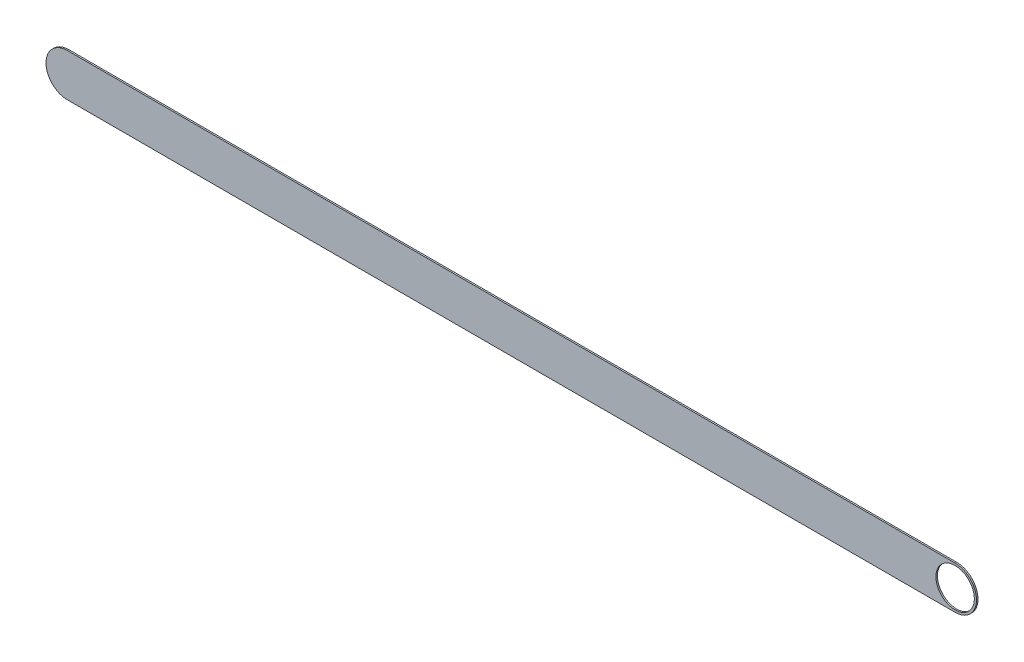
ISO-10303-21;
HEADER;
FILE_DESCRIPTION(('STEP AP214'),'2;1');
FILE_NAME('part.step','',(''),(''),'','','');
FILE_SCHEMA(('AUTOMOTIVE_DESIGN { 1 0 10303 214 1 1 1 1 }'));
ENDSEC;
DATA;
#1=APPLICATION_CONTEXT('core data for automotive mechanical design processes');
#2=APPLICATION_PROTOCOL_DEFINITION('international standard','automotive_design',2000,#1);
#3=PRODUCT_CONTEXT('',#1,'mechanical');
#4=PRODUCT('Part','Part','',(#3));
#5=PRODUCT_RELATED_PRODUCT_CATEGORY('part','',(#4));
#6=PRODUCT_DEFINITION_FORMATION('','',#4);
#7=PRODUCT_DEFINITION_CONTEXT('part definition',#1,'design');
#8=PRODUCT_DEFINITION('design','',#6,#7);
#9=PRODUCT_DEFINITION_SHAPE('','',#8);
#10=(LENGTH_UNIT() NAMED_UNIT(*) SI_UNIT(.MILLI.,.METRE.));
#11=(NAMED_UNIT(*) PLANE_ANGLE_UNIT() SI_UNIT($,.RADIAN.));
#12=(NAMED_UNIT(*) SI_UNIT($,.STERADIAN.) SOLID_ANGLE_UNIT());
#13=UNCERTAINTY_MEASURE_WITH_UNIT(LENGTH_MEASURE(1.E-05),#10,'distance_accuracy_value','');
#14=(GEOMETRIC_REPRESENTATION_CONTEXT(3) GLOBAL_UNCERTAINTY_ASSIGNED_CONTEXT((#13)) GLOBAL_UNIT_ASSIGNED_CONTEXT((#10,
#11,#12)) REPRESENTATION_CONTEXT('',''));
#15=CARTESIAN_POINT('',(0.,0.,0.));
#16=DIRECTION('',(0.,0.,1.));
#17=DIRECTION('',(1.,0.,0.));
#18=AXIS2_PLACEMENT_3D('',#15,#16,#17);
#19=CARTESIAN_POINT('',(59.1000088,79.6600134,0.));
#20=DIRECTION('',(0.,1.,0.));
#21=DIRECTION('',(1.,0.,0.));
#22=AXIS2_PLACEMENT_3D('',#19,#20,#21);
#23=PLANE('',#22);
#24=DIRECTION('',(1.,0.,0.));
#25=VECTOR('',#24,1.);
#26=CARTESIAN_POINT('',(59.1000088,79.6600134,0.03556));
#27=LINE('',#26,#25);
#28=CARTESIAN_POINT('',(59.1000088,79.6600134,0.03556));
#29=VERTEX_POINT('',#28);
#30=CARTESIAN_POINT('',(79.900018,79.6600134,0.03556));
#31=VERTEX_POINT('',#30);
#32=EDGE_CURVE('E11',#29,#31,#27,.T.);
#33=ORIENTED_EDGE('',*,*,#32,.F.);
#34=DIRECTION('',(0.,0.,1.));
#35=VECTOR('',#34,1.);
#36=CARTESIAN_POINT('',(59.1000088,79.6600134,0.));
#37=LINE('',#36,#35);
#38=CARTESIAN_POINT('',(59.1000088,79.6600134,0.));
#39=VERTEX_POINT('',#38);
#40=EDGE_CURVE('E24',#39,#29,#37,.T.);
#41=ORIENTED_EDGE('',*,*,#40,.F.);
#42=DIRECTION('',(1.,0.,0.));
#43=VECTOR('',#42,1.);
#44=CARTESIAN_POINT('',(59.1000088,79.6600134,0.));
#45=LINE('',#44,#43);
#46=CARTESIAN_POINT('',(79.900018,79.6600134,0.));
#47=VERTEX_POINT('',#46);
#48=EDGE_CURVE('E96',#39,#47,#45,.T.);
#49=ORIENTED_EDGE('',*,*,#48,.T.);
#50=DIRECTION('',(0.,0.,1.));
#51=VECTOR('',#50,1.);
#52=CARTESIAN_POINT('',(79.900018,79.6600134,0.));
#53=LINE('',#52,#51);
#54=EDGE_CURVE('E37',#47,#31,#53,.T.);
#55=ORIENTED_EDGE('',*,*,#54,.T.);
#56=EDGE_LOOP('',(#33,#41,#49,#55));
#57=FACE_BOUND('',#56,.T.);
#58=ADVANCED_FACE('F17',(#57),#23,.F.);
#59=CARTESIAN_POINT('',(59.1000088,80.1600124,0.));
#60=DIRECTION('',(0.,0.,-1.));
#61=DIRECTION('',(0.,1.,0.));
#62=AXIS2_PLACEMENT_3D('',#59,#60,#61);
#63=CYLINDRICAL_SURFACE('',#62,0.499998999999995);
#64=CARTESIAN_POINT('',(59.1000088,80.1600124,0.03556));
#65=DIRECTION('',(0.,0.,1.));
#66=DIRECTION('',(0.,1.,0.));
#67=AXIS2_PLACEMENT_3D('',#64,#65,#66);
#68=CIRCLE('',#67,0.499998999999995);
#69=CARTESIAN_POINT('',(59.1000088,80.6600114,0.03556));
#70=VERTEX_POINT('',#69);
#71=EDGE_CURVE('E92',#70,#29,#68,.T.);
#72=ORIENTED_EDGE('',*,*,#71,.F.);
#73=DIRECTION('',(0.,0.,1.));
#74=VECTOR('',#73,1.);
#75=CARTESIAN_POINT('',(59.1000088,80.6600114,0.));
#76=LINE('',#75,#74);
#77=CARTESIAN_POINT('',(59.1000088,80.6600114,0.));
#78=VERTEX_POINT('',#77);
#79=EDGE_CURVE('E90',#78,#70,#76,.T.);
#80=ORIENTED_EDGE('',*,*,#79,.F.);
#81=CARTESIAN_POINT('',(59.1000088,80.1600124,0.));
#82=DIRECTION('',(0.,0.,1.));
#83=DIRECTION('',(0.,1.,0.));
#84=AXIS2_PLACEMENT_3D('',#81,#82,#83);
#85=CIRCLE('',#84,0.499998999999995);
#86=EDGE_CURVE('E88',#78,#39,#85,.T.);
#87=ORIENTED_EDGE('',*,*,#86,.T.);
#88=ORIENTED_EDGE('',*,*,#40,.T.);
#89=EDGE_LOOP('',(#72,#80,#87,#88));
#90=FACE_BOUND('',#89,.T.);
#91=ADVANCED_FACE('F111',(#90),#63,.T.);
#92=CARTESIAN_POINT('',(79.900018,80.1600124,0.));
#93=DIRECTION('',(0.,0.,-1.));
#94=DIRECTION('',(0.,-1.,0.));
#95=AXIS2_PLACEMENT_3D('',#92,#93,#94);
#96=CYLINDRICAL_SURFACE('',#95,0.499998999999998);
#97=CARTESIAN_POINT('',(79.900018,80.1600124,0.03556));
#98=DIRECTION('',(0.,0.,1.));
#99=DIRECTION('',(0.,-1.,0.));
#100=AXIS2_PLACEMENT_3D('',#97,#98,#99);
#101=CIRCLE('',#100,0.499998999999998);
#102=CARTESIAN_POINT('',(79.900018,80.6600114,0.03556));
#103=VERTEX_POINT('',#102);
#104=EDGE_CURVE('E85',#31,#103,#101,.T.);
#105=ORIENTED_EDGE('',*,*,#104,.F.);
#106=ORIENTED_EDGE('',*,*,#54,.F.);
#107=CARTESIAN_POINT('',(79.900018,80.1600124,0.));
#108=DIRECTION('',(0.,0.,1.));
#109=DIRECTION('',(0.,-1.,0.));
#110=AXIS2_PLACEMENT_3D('',#107,#108,#109);
#111=CIRCLE('',#110,0.499998999999998);
#112=CARTESIAN_POINT('',(79.900018,80.6600114,0.));
#113=VERTEX_POINT('',#112);
#114=EDGE_CURVE('E82',#47,#113,#111,.T.);
#115=ORIENTED_EDGE('',*,*,#114,.T.);
#116=DIRECTION('',(0.,0.,1.));
#117=VECTOR('',#116,1.);
#118=CARTESIAN_POINT('',(79.900018,80.6600114,0.));
#119=LINE('',#118,#117);
#120=EDGE_CURVE('E80',#113,#103,#119,.T.);
#121=ORIENTED_EDGE('',*,*,#120,.T.);
#122=EDGE_LOOP('',(#105,#106,#115,#121));
#123=FACE_BOUND('',#122,.T.);
#124=ADVANCED_FACE('F104',(#123),#96,.T.);
#125=CARTESIAN_POINT('',(79.900018,80.6600114,0.));
#126=DIRECTION('',(0.,-1.,0.));
#127=DIRECTION('',(-1.,0.,0.));
#128=AXIS2_PLACEMENT_3D('',#125,#126,#127);
#129=PLANE('',#128);
#130=DIRECTION('',(-1.,0.,0.));
#131=VECTOR('',#130,1.);
#132=CARTESIAN_POINT('',(79.900018,80.6600114,0.03556));
#133=LINE('',#132,#131);
#134=EDGE_CURVE('E77',#103,#70,#133,.T.);
#135=ORIENTED_EDGE('',*,*,#134,.F.);
#136=ORIENTED_EDGE('',*,*,#120,.F.);
#137=DIRECTION('',(-1.,0.,0.));
#138=VECTOR('',#137,1.);
#139=CARTESIAN_POINT('',(79.900018,80.6600114,0.));
#140=LINE('',#139,#138);
#141=EDGE_CURVE('E68',#113,#78,#140,.T.);
#142=ORIENTED_EDGE('',*,*,#141,.T.);
#143=ORIENTED_EDGE('',*,*,#79,.T.);
#144=EDGE_LOOP('',(#135,#136,#142,#143));
#145=FACE_BOUND('',#144,.T.);
#146=ADVANCED_FACE('F110',(#145),#129,.F.);
#147=CARTESIAN_POINT('',(79.900018,80.1600124,0.));
#148=DIRECTION('',(0.,0.,-1.));
#149=DIRECTION('',(1.,0.,0.));
#150=AXIS2_PLACEMENT_3D('',#147,#148,#149);
#151=CYLINDRICAL_SURFACE('',#150,0.4499991);
#152=DIRECTION('',(0.,0.,1.));
#153=VECTOR('',#152,1.);
#154=CARTESIAN_POINT('',(80.3500171,80.1600124,0.));
#155=LINE('',#154,#153);
#156=CARTESIAN_POINT('',(80.3500171,80.1600124,0.));
#157=VERTEX_POINT('',#156);
#158=CARTESIAN_POINT('',(80.3500171,80.1600124,0.03556));
#159=VERTEX_POINT('',#158);
#160=EDGE_CURVE('E62',#157,#159,#155,.T.);
#161=ORIENTED_EDGE('',*,*,#160,.T.);
#162=CARTESIAN_POINT('',(79.900018,80.1600124,0.03556));
#163=DIRECTION('',(0.,0.,1.));
#164=DIRECTION('',(1.,0.,0.));
#165=AXIS2_PLACEMENT_3D('',#162,#163,#164);
#166=CIRCLE('',#165,0.4499991);
#167=EDGE_CURVE('E67',#159,#159,#166,.T.);
#168=ORIENTED_EDGE('',*,*,#167,.T.);
#169=ORIENTED_EDGE('',*,*,#160,.F.);
#170=CARTESIAN_POINT('',(79.900018,80.1600124,0.));
#171=DIRECTION('',(0.,0.,1.));
#172=DIRECTION('',(1.,0.,0.));
#173=AXIS2_PLACEMENT_3D('',#170,#171,#172);
#174=CIRCLE('',#173,0.4499991);
#175=EDGE_CURVE('E65',#157,#157,#174,.T.);
#176=ORIENTED_EDGE('',*,*,#175,.F.);
#177=EDGE_LOOP('',(#161,#168,#169,#176));
#178=FACE_BOUND('',#177,.T.);
#179=ADVANCED_FACE('F64',(#178),#151,.F.);
#180=CARTESIAN_POINT('',(59.1000088,79.6600134,0.));
#181=DIRECTION('',(0.,0.,-1.));
#182=DIRECTION('',(-1.,0.,0.));
#183=AXIS2_PLACEMENT_3D('',#180,#181,#182);
#184=PLANE('',#183);
#185=ORIENTED_EDGE('',*,*,#48,.F.);
#186=ORIENTED_EDGE('',*,*,#86,.F.);
#187=ORIENTED_EDGE('',*,*,#141,.F.);
#188=ORIENTED_EDGE('',*,*,#114,.F.);
#189=EDGE_LOOP('',(#185,#186,#187,#188));
#190=FACE_BOUND('',#189,.T.);
#191=ORIENTED_EDGE('',*,*,#175,.T.);
#192=EDGE_LOOP('',(#191));
#193=FACE_BOUND('',#192,.T.);
#194=ADVANCED_FACE('F71',(#190,#193),#184,.T.);
#195=CARTESIAN_POINT('',(59.1000088,79.6600134,0.03556));
#196=DIRECTION('',(0.,0.,-1.));
#197=DIRECTION('',(-1.,0.,0.));
#198=AXIS2_PLACEMENT_3D('',#195,#196,#197);
#199=PLANE('',#198);
#200=ORIENTED_EDGE('',*,*,#134,.T.);
#201=ORIENTED_EDGE('',*,*,#71,.T.);
#202=ORIENTED_EDGE('',*,*,#32,.T.);
#203=ORIENTED_EDGE('',*,*,#104,.T.);
#204=EDGE_LOOP('',(#200,#201,#202,#203));
#205=FACE_BOUND('',#204,.T.);
#206=ORIENTED_EDGE('',*,*,#167,.F.);
#207=EDGE_LOOP('',(#206));
#208=FACE_BOUND('',#207,.T.);
#209=ADVANCED_FACE('F107',(#205,#208),#199,.F.);
#210=CLOSED_SHELL('',(#58,#91,#124,#146,#179,#194,#209));
#211=MANIFOLD_SOLID_BREP('B1',#210);
#212=ADVANCED_BREP_SHAPE_REPRESENTATION('',(#18,#211),#14);
#213=SHAPE_DEFINITION_REPRESENTATION(#9,#212);
ENDSEC;
END-ISO-10303-21;
